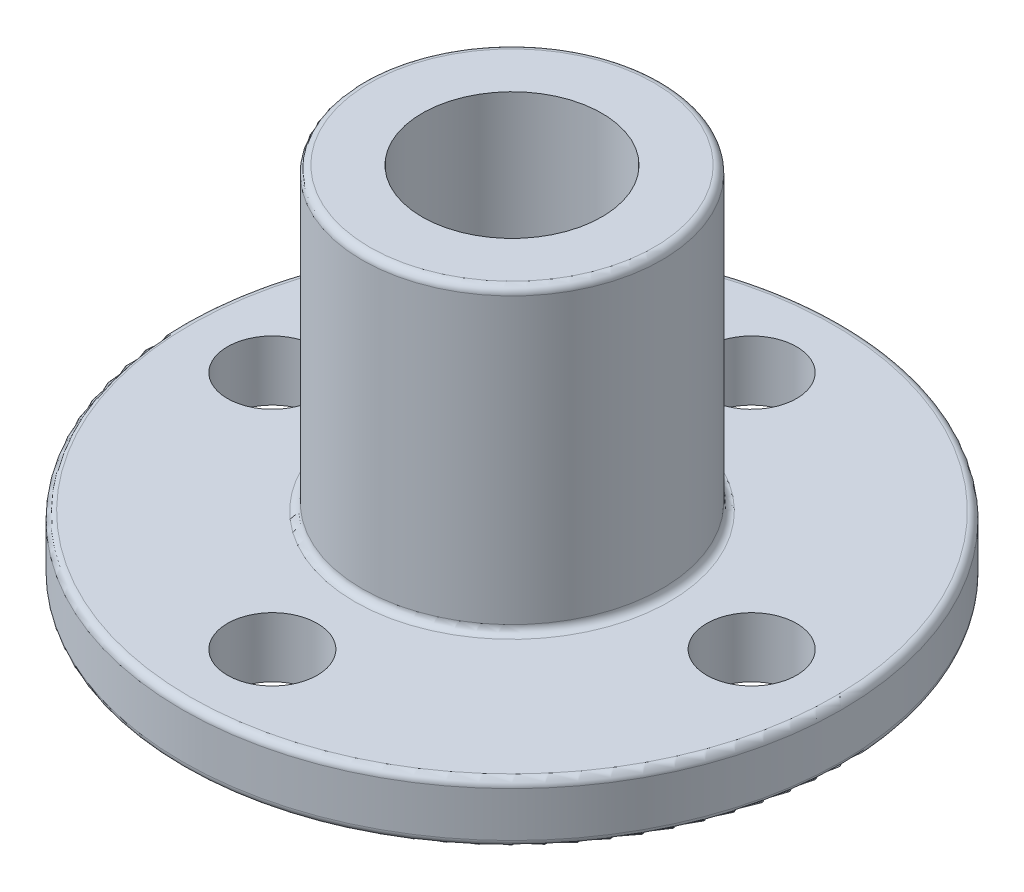
ISO-10303-21;
HEADER;
FILE_DESCRIPTION(('STEP AP214'),'2;1');
FILE_NAME('part.step','',(''),(''),'','','');
FILE_SCHEMA(('AUTOMOTIVE_DESIGN { 1 0 10303 214 1 1 1 1 }'));
ENDSEC;
DATA;
#1=APPLICATION_CONTEXT('core data for automotive mechanical design processes');
#2=APPLICATION_PROTOCOL_DEFINITION('international standard','automotive_design',2000,#1);
#3=PRODUCT_CONTEXT('',#1,'mechanical');
#4=PRODUCT('Part','Part','',(#3));
#5=PRODUCT_RELATED_PRODUCT_CATEGORY('part','',(#4));
#6=PRODUCT_DEFINITION_FORMATION('','',#4);
#7=PRODUCT_DEFINITION_CONTEXT('part definition',#1,'design');
#8=PRODUCT_DEFINITION('design','',#6,#7);
#9=PRODUCT_DEFINITION_SHAPE('','',#8);
#10=(LENGTH_UNIT() NAMED_UNIT(*) SI_UNIT(.MILLI.,.METRE.));
#11=(NAMED_UNIT(*) PLANE_ANGLE_UNIT() SI_UNIT($,.RADIAN.));
#12=(NAMED_UNIT(*) SI_UNIT($,.STERADIAN.) SOLID_ANGLE_UNIT());
#13=UNCERTAINTY_MEASURE_WITH_UNIT(LENGTH_MEASURE(1.E-05),#10,'distance_accuracy_value','');
#14=(GEOMETRIC_REPRESENTATION_CONTEXT(3) GLOBAL_UNCERTAINTY_ASSIGNED_CONTEXT((#13)) GLOBAL_UNIT_ASSIGNED_CONTEXT((#10,
#11,#12)) REPRESENTATION_CONTEXT('',''));
#15=CARTESIAN_POINT('',(0.,0.,0.));
#16=DIRECTION('',(0.,0.,1.));
#17=DIRECTION('',(1.,0.,0.));
#18=AXIS2_PLACEMENT_3D('',#15,#16,#17);
#19=CARTESIAN_POINT('',(0.,2.,0.));
#20=DIRECTION('',(0.,-1.,0.));
#21=DIRECTION('',(0.,0.,-1.));
#22=AXIS2_PLACEMENT_3D('',#19,#20,#21);
#23=CYLINDRICAL_SURFACE('',#22,11.);
#24=CARTESIAN_POINT('',(0.,0.25,0.));
#25=DIRECTION('',(0.,1.,0.));
#26=DIRECTION('',(0.,0.,1.));
#27=AXIS2_PLACEMENT_3D('',#24,#25,#26);
#28=CIRCLE('',#27,11.);
#29=CARTESIAN_POINT('',(0.,0.25,11.));
#30=VERTEX_POINT('',#29);
#31=EDGE_CURVE('E46',#30,#30,#28,.T.);
#32=ORIENTED_EDGE('',*,*,#31,.T.);
#33=EDGE_LOOP('',(#32));
#34=FACE_BOUND('',#33,.T.);
#35=CARTESIAN_POINT('',(0.,1.75,0.));
#36=DIRECTION('',(0.,1.,0.));
#37=DIRECTION('',(0.,0.,1.));
#38=AXIS2_PLACEMENT_3D('',#35,#36,#37);
#39=CIRCLE('',#38,11.);
#40=CARTESIAN_POINT('',(0.,1.75,11.));
#41=VERTEX_POINT('',#40);
#42=EDGE_CURVE('E50',#41,#41,#39,.F.);
#43=ORIENTED_EDGE('',*,*,#42,.T.);
#44=EDGE_LOOP('',(#43));
#45=FACE_BOUND('',#44,.T.);
#46=ADVANCED_FACE('F39',(#34,#45),#23,.T.);
#47=CARTESIAN_POINT('',(0.,2.,0.));
#48=DIRECTION('',(0.,1.,0.));
#49=DIRECTION('',(0.,0.,1.));
#50=AXIS2_PLACEMENT_3D('',#47,#48,#49);
#51=PLANE('',#50);
#52=CARTESIAN_POINT('',(0.,2.,0.));
#53=DIRECTION('',(0.,1.,0.));
#54=DIRECTION('',(0.,0.,1.));
#55=AXIS2_PLACEMENT_3D('',#52,#53,#54);
#56=CIRCLE('',#55,5.25);
#57=CARTESIAN_POINT('',(0.,2.,5.25));
#58=VERTEX_POINT('',#57);
#59=EDGE_CURVE('E59',#58,#58,#56,.F.);
#60=ORIENTED_EDGE('',*,*,#59,.T.);
#61=EDGE_LOOP('',(#60));
#62=FACE_BOUND('',#61,.T.);
#63=CARTESIAN_POINT('',(0.,2.,0.));
#64=DIRECTION('',(0.,1.,0.));
#65=DIRECTION('',(0.,0.,1.));
#66=AXIS2_PLACEMENT_3D('',#63,#64,#65);
#67=CIRCLE('',#66,10.75);
#68=CARTESIAN_POINT('',(0.,2.,10.75));
#69=VERTEX_POINT('',#68);
#70=EDGE_CURVE('E62',#69,#69,#67,.T.);
#71=ORIENTED_EDGE('',*,*,#70,.T.);
#72=EDGE_LOOP('',(#71));
#73=FACE_BOUND('',#72,.T.);
#74=CARTESIAN_POINT('',(-8.,2.,0.));
#75=DIRECTION('',(0.,1.,0.));
#76=DIRECTION('',(0.,0.,1.));
#77=AXIS2_PLACEMENT_3D('',#74,#75,#76);
#78=CIRCLE('',#77,1.5);
#79=CARTESIAN_POINT('',(-8.,2.,1.49999999999997));
#80=VERTEX_POINT('',#79);
#81=EDGE_CURVE('E83',#80,#80,#78,.T.);
#82=ORIENTED_EDGE('',*,*,#81,.F.);
#83=EDGE_LOOP('',(#82));
#84=FACE_BOUND('',#83,.T.);
#85=CARTESIAN_POINT('',(0.,2.,-8.));
#86=DIRECTION('',(0.,1.,0.));
#87=DIRECTION('',(0.,0.,1.));
#88=AXIS2_PLACEMENT_3D('',#85,#86,#87);
#89=CIRCLE('',#88,1.5);
#90=CARTESIAN_POINT('',(0.,2.,-6.5));
#91=VERTEX_POINT('',#90);
#92=EDGE_CURVE('E86',#91,#91,#89,.T.);
#93=ORIENTED_EDGE('',*,*,#92,.F.);
#94=EDGE_LOOP('',(#93));
#95=FACE_BOUND('',#94,.T.);
#96=CARTESIAN_POINT('',(8.,2.,0.));
#97=DIRECTION('',(0.,1.,0.));
#98=DIRECTION('',(0.,0.,1.));
#99=AXIS2_PLACEMENT_3D('',#96,#97,#98);
#100=CIRCLE('',#99,1.5);
#101=CARTESIAN_POINT('',(8.,2.,1.50000000000008));
#102=VERTEX_POINT('',#101);
#103=EDGE_CURVE('E89',#102,#102,#100,.T.);
#104=ORIENTED_EDGE('',*,*,#103,.F.);
#105=EDGE_LOOP('',(#104));
#106=FACE_BOUND('',#105,.T.);
#107=CARTESIAN_POINT('',(0.,2.,8.));
#108=DIRECTION('',(0.,1.,0.));
#109=DIRECTION('',(0.,0.,1.));
#110=AXIS2_PLACEMENT_3D('',#107,#108,#109);
#111=CIRCLE('',#110,1.5);
#112=CARTESIAN_POINT('',(0.,2.,9.5));
#113=VERTEX_POINT('',#112);
#114=EDGE_CURVE('E75',#113,#113,#111,.T.);
#115=ORIENTED_EDGE('',*,*,#114,.F.);
#116=EDGE_LOOP('',(#115));
#117=FACE_BOUND('',#116,.T.);
#118=ADVANCED_FACE('F108',(#62,#73,#84,#95,#106,#117),#51,.T.);
#119=CARTESIAN_POINT('',(0.,0.,0.));
#120=DIRECTION('',(0.,1.,0.));
#121=DIRECTION('',(0.,0.,1.));
#122=AXIS2_PLACEMENT_3D('',#119,#120,#121);
#123=PLANE('',#122);
#124=CARTESIAN_POINT('',(0.,0.,0.));
#125=DIRECTION('',(0.,1.,0.));
#126=DIRECTION('',(0.,0.,1.));
#127=AXIS2_PLACEMENT_3D('',#124,#125,#126);
#128=CIRCLE('',#127,10.75);
#129=CARTESIAN_POINT('',(0.,0.,10.75));
#130=VERTEX_POINT('',#129);
#131=EDGE_CURVE('E10',#130,#130,#128,.F.);
#132=ORIENTED_EDGE('',*,*,#131,.T.);
#133=EDGE_LOOP('',(#132));
#134=FACE_BOUND('',#133,.T.);
#135=CARTESIAN_POINT('',(-8.,0.,0.));
#136=DIRECTION('',(0.,-1.,0.));
#137=DIRECTION('',(1.,0.,0.));
#138=AXIS2_PLACEMENT_3D('',#135,#136,#137);
#139=CIRCLE('',#138,1.5);
#140=CARTESIAN_POINT('',(-6.5,0.,0.));
#141=VERTEX_POINT('',#140);
#142=EDGE_CURVE('E92',#141,#141,#139,.T.);
#143=ORIENTED_EDGE('',*,*,#142,.F.);
#144=EDGE_LOOP('',(#143));
#145=FACE_BOUND('',#144,.T.);
#146=CARTESIAN_POINT('',(0.,0.,-8.));
#147=DIRECTION('',(0.,-1.,0.));
#148=DIRECTION('',(0.,0.,1.));
#149=AXIS2_PLACEMENT_3D('',#146,#147,#148);
#150=CIRCLE('',#149,1.5);
#151=CARTESIAN_POINT('',(0.,0.,-6.5));
#152=VERTEX_POINT('',#151);
#153=EDGE_CURVE('E96',#152,#152,#150,.T.);
#154=ORIENTED_EDGE('',*,*,#153,.F.);
#155=EDGE_LOOP('',(#154));
#156=FACE_BOUND('',#155,.T.);
#157=CARTESIAN_POINT('',(8.,0.,0.));
#158=DIRECTION('',(0.,-1.,0.));
#159=DIRECTION('',(-1.,0.,0.));
#160=AXIS2_PLACEMENT_3D('',#157,#158,#159);
#161=CIRCLE('',#160,1.5);
#162=CARTESIAN_POINT('',(6.5,0.,0.));
#163=VERTEX_POINT('',#162);
#164=EDGE_CURVE('E93',#163,#163,#161,.T.);
#165=ORIENTED_EDGE('',*,*,#164,.F.);
#166=EDGE_LOOP('',(#165));
#167=FACE_BOUND('',#166,.T.);
#168=CARTESIAN_POINT('',(0.,0.,8.));
#169=DIRECTION('',(0.,-1.,0.));
#170=DIRECTION('',(0.,0.,-1.));
#171=AXIS2_PLACEMENT_3D('',#168,#169,#170);
#172=CIRCLE('',#171,1.5);
#173=CARTESIAN_POINT('',(0.,0.,6.5));
#174=VERTEX_POINT('',#173);
#175=EDGE_CURVE('E80',#174,#174,#172,.T.);
#176=ORIENTED_EDGE('',*,*,#175,.F.);
#177=EDGE_LOOP('',(#176));
#178=FACE_BOUND('',#177,.T.);
#179=CARTESIAN_POINT('',(0.,0.,0.));
#180=DIRECTION('',(0.,1.,0.));
#181=DIRECTION('',(0.,0.,1.));
#182=AXIS2_PLACEMENT_3D('',#179,#180,#181);
#183=CIRCLE('',#182,3.);
#184=CARTESIAN_POINT('',(0.,0.,3.));
#185=VERTEX_POINT('',#184);
#186=EDGE_CURVE('E71',#185,#185,#183,.T.);
#187=ORIENTED_EDGE('',*,*,#186,.T.);
#188=EDGE_LOOP('',(#187));
#189=FACE_BOUND('',#188,.T.);
#190=ADVANCED_FACE('F104',(#134,#145,#156,#167,#178,#189),#123,.F.);
#191=CARTESIAN_POINT('',(0.,12.,0.));
#192=DIRECTION('',(0.,-1.,0.));
#193=DIRECTION('',(0.,0.,-1.));
#194=AXIS2_PLACEMENT_3D('',#191,#192,#193);
#195=CYLINDRICAL_SURFACE('',#194,5.);
#196=CARTESIAN_POINT('',(0.,2.25,0.));
#197=DIRECTION('',(0.,1.,0.));
#198=DIRECTION('',(0.,0.,1.));
#199=AXIS2_PLACEMENT_3D('',#196,#197,#198);
#200=CIRCLE('',#199,5.);
#201=CARTESIAN_POINT('',(0.,2.25,5.));
#202=VERTEX_POINT('',#201);
#203=EDGE_CURVE('E65',#202,#202,#200,.T.);
#204=ORIENTED_EDGE('',*,*,#203,.T.);
#205=EDGE_LOOP('',(#204));
#206=FACE_BOUND('',#205,.T.);
#207=CARTESIAN_POINT('',(0.,11.75,0.));
#208=DIRECTION('',(0.,1.,0.));
#209=DIRECTION('',(0.,0.,1.));
#210=AXIS2_PLACEMENT_3D('',#207,#208,#209);
#211=CIRCLE('',#210,5.);
#212=CARTESIAN_POINT('',(0.,11.75,5.));
#213=VERTEX_POINT('',#212);
#214=EDGE_CURVE('E68',#213,#213,#211,.F.);
#215=ORIENTED_EDGE('',*,*,#214,.T.);
#216=EDGE_LOOP('',(#215));
#217=FACE_BOUND('',#216,.T.);
#218=ADVANCED_FACE('F107',(#206,#217),#195,.T.);
#219=CARTESIAN_POINT('',(0.,12.,0.));
#220=DIRECTION('',(0.,1.,0.));
#221=DIRECTION('',(0.,0.,1.));
#222=AXIS2_PLACEMENT_3D('',#219,#220,#221);
#223=PLANE('',#222);
#224=CARTESIAN_POINT('',(0.,12.,0.));
#225=DIRECTION('',(0.,1.,0.));
#226=DIRECTION('',(0.,0.,1.));
#227=AXIS2_PLACEMENT_3D('',#224,#225,#226);
#228=CIRCLE('',#227,4.75);
#229=CARTESIAN_POINT('',(0.,12.,4.75));
#230=VERTEX_POINT('',#229);
#231=EDGE_CURVE('E54',#230,#230,#228,.T.);
#232=ORIENTED_EDGE('',*,*,#231,.T.);
#233=EDGE_LOOP('',(#232));
#234=FACE_BOUND('',#233,.T.);
#235=CARTESIAN_POINT('',(0.,12.,0.));
#236=DIRECTION('',(0.,1.,0.));
#237=DIRECTION('',(0.,0.,1.));
#238=AXIS2_PLACEMENT_3D('',#235,#236,#237);
#239=CIRCLE('',#238,3.);
#240=CARTESIAN_POINT('',(0.,12.,3.));
#241=VERTEX_POINT('',#240);
#242=EDGE_CURVE('E72',#241,#241,#239,.T.);
#243=ORIENTED_EDGE('',*,*,#242,.F.);
#244=EDGE_LOOP('',(#243));
#245=FACE_BOUND('',#244,.T.);
#246=ADVANCED_FACE('F122',(#234,#245),#223,.T.);
#247=CARTESIAN_POINT('',(0.,0.,0.));
#248=DIRECTION('',(0.,1.,0.));
#249=DIRECTION('',(0.,0.,1.));
#250=AXIS2_PLACEMENT_3D('',#247,#248,#249);
#251=CYLINDRICAL_SURFACE('',#250,3.);
#252=ORIENTED_EDGE('',*,*,#186,.F.);
#253=EDGE_LOOP('',(#252));
#254=FACE_BOUND('',#253,.T.);
#255=ORIENTED_EDGE('',*,*,#242,.T.);
#256=EDGE_LOOP('',(#255));
#257=FACE_BOUND('',#256,.T.);
#258=ADVANCED_FACE('F118',(#254,#257),#251,.F.);
#259=CARTESIAN_POINT('',(0.,12.,8.));
#260=DIRECTION('',(0.,-1.,0.));
#261=DIRECTION('',(0.,0.,-1.));
#262=AXIS2_PLACEMENT_3D('',#259,#260,#261);
#263=CYLINDRICAL_SURFACE('',#262,1.5);
#264=ORIENTED_EDGE('',*,*,#114,.T.);
#265=EDGE_LOOP('',(#264));
#266=FACE_BOUND('',#265,.T.);
#267=ORIENTED_EDGE('',*,*,#175,.T.);
#268=EDGE_LOOP('',(#267));
#269=FACE_BOUND('',#268,.T.);
#270=ADVANCED_FACE('F121',(#266,#269),#263,.F.);
#271=CARTESIAN_POINT('',(8.,12.,0.));
#272=DIRECTION('',(0.,-1.,0.));
#273=DIRECTION('',(0.,0.,-1.));
#274=AXIS2_PLACEMENT_3D('',#271,#272,#273);
#275=CYLINDRICAL_SURFACE('',#274,1.5);
#276=ORIENTED_EDGE('',*,*,#103,.T.);
#277=EDGE_LOOP('',(#276));
#278=FACE_BOUND('',#277,.T.);
#279=ORIENTED_EDGE('',*,*,#164,.T.);
#280=EDGE_LOOP('',(#279));
#281=FACE_BOUND('',#280,.T.);
#282=ADVANCED_FACE('F176',(#278,#281),#275,.F.);
#283=CARTESIAN_POINT('',(0.,12.,-8.));
#284=DIRECTION('',(0.,-1.,0.));
#285=DIRECTION('',(0.,0.,-1.));
#286=AXIS2_PLACEMENT_3D('',#283,#284,#285);
#287=CYLINDRICAL_SURFACE('',#286,1.5);
#288=ORIENTED_EDGE('',*,*,#92,.T.);
#289=EDGE_LOOP('',(#288));
#290=FACE_BOUND('',#289,.T.);
#291=ORIENTED_EDGE('',*,*,#153,.T.);
#292=EDGE_LOOP('',(#291));
#293=FACE_BOUND('',#292,.T.);
#294=ADVANCED_FACE('F181',(#290,#293),#287,.F.);
#295=CARTESIAN_POINT('',(-8.,12.,0.));
#296=DIRECTION('',(0.,-1.,0.));
#297=DIRECTION('',(0.,0.,-1.));
#298=AXIS2_PLACEMENT_3D('',#295,#296,#297);
#299=CYLINDRICAL_SURFACE('',#298,1.5);
#300=ORIENTED_EDGE('',*,*,#81,.T.);
#301=EDGE_LOOP('',(#300));
#302=FACE_BOUND('',#301,.T.);
#303=ORIENTED_EDGE('',*,*,#142,.T.);
#304=EDGE_LOOP('',(#303));
#305=FACE_BOUND('',#304,.T.);
#306=ADVANCED_FACE('F102',(#302,#305),#299,.F.);
#307=CARTESIAN_POINT('',(0.,2.25,0.));
#308=DIRECTION('',(0.,1.,0.));
#309=DIRECTION('',(0.,0.,1.));
#310=AXIS2_PLACEMENT_3D('',#307,#308,#309);
#311=TOROIDAL_SURFACE('',#310,5.25,0.25);
#312=ORIENTED_EDGE('',*,*,#59,.F.);
#313=EDGE_LOOP('',(#312));
#314=FACE_BOUND('',#313,.T.);
#315=ORIENTED_EDGE('',*,*,#203,.F.);
#316=EDGE_LOOP('',(#315));
#317=FACE_BOUND('',#316,.T.);
#318=ADVANCED_FACE('F145',(#314,#317),#311,.F.);
#319=CARTESIAN_POINT('',(0.,11.75,0.));
#320=DIRECTION('',(0.,1.,0.));
#321=DIRECTION('',(0.,0.,1.));
#322=AXIS2_PLACEMENT_3D('',#319,#320,#321);
#323=TOROIDAL_SURFACE('',#322,4.75,0.25);
#324=ORIENTED_EDGE('',*,*,#214,.F.);
#325=EDGE_LOOP('',(#324));
#326=FACE_BOUND('',#325,.T.);
#327=ORIENTED_EDGE('',*,*,#231,.F.);
#328=EDGE_LOOP('',(#327));
#329=FACE_BOUND('',#328,.T.);
#330=ADVANCED_FACE('F147',(#326,#329),#323,.T.);
#331=CARTESIAN_POINT('',(0.,0.25,0.));
#332=DIRECTION('',(0.,1.,0.));
#333=DIRECTION('',(0.,0.,1.));
#334=AXIS2_PLACEMENT_3D('',#331,#332,#333);
#335=TOROIDAL_SURFACE('',#334,10.75,0.25);
#336=ORIENTED_EDGE('',*,*,#131,.F.);
#337=EDGE_LOOP('',(#336));
#338=FACE_BOUND('',#337,.T.);
#339=ORIENTED_EDGE('',*,*,#31,.F.);
#340=EDGE_LOOP('',(#339));
#341=FACE_BOUND('',#340,.T.);
#342=ADVANCED_FACE('F150',(#338,#341),#335,.T.);
#343=CARTESIAN_POINT('',(0.,1.75,0.));
#344=DIRECTION('',(0.,1.,0.));
#345=DIRECTION('',(0.,0.,1.));
#346=AXIS2_PLACEMENT_3D('',#343,#344,#345);
#347=TOROIDAL_SURFACE('',#346,10.75,0.25);
#348=ORIENTED_EDGE('',*,*,#42,.F.);
#349=EDGE_LOOP('',(#348));
#350=FACE_BOUND('',#349,.T.);
#351=ORIENTED_EDGE('',*,*,#70,.F.);
#352=EDGE_LOOP('',(#351));
#353=FACE_BOUND('',#352,.T.);
#354=ADVANCED_FACE('F41',(#350,#353),#347,.T.);
#355=CLOSED_SHELL('',(#46,#118,#190,#218,#246,#258,#270,#282,#294,#306,#318,#330,#342,#354));
#356=MANIFOLD_SOLID_BREP('B2',#355);
#357=ADVANCED_BREP_SHAPE_REPRESENTATION('',(#18,#356),#14);
#358=SHAPE_DEFINITION_REPRESENTATION(#9,#357);
ENDSEC;
END-ISO-10303-21;
